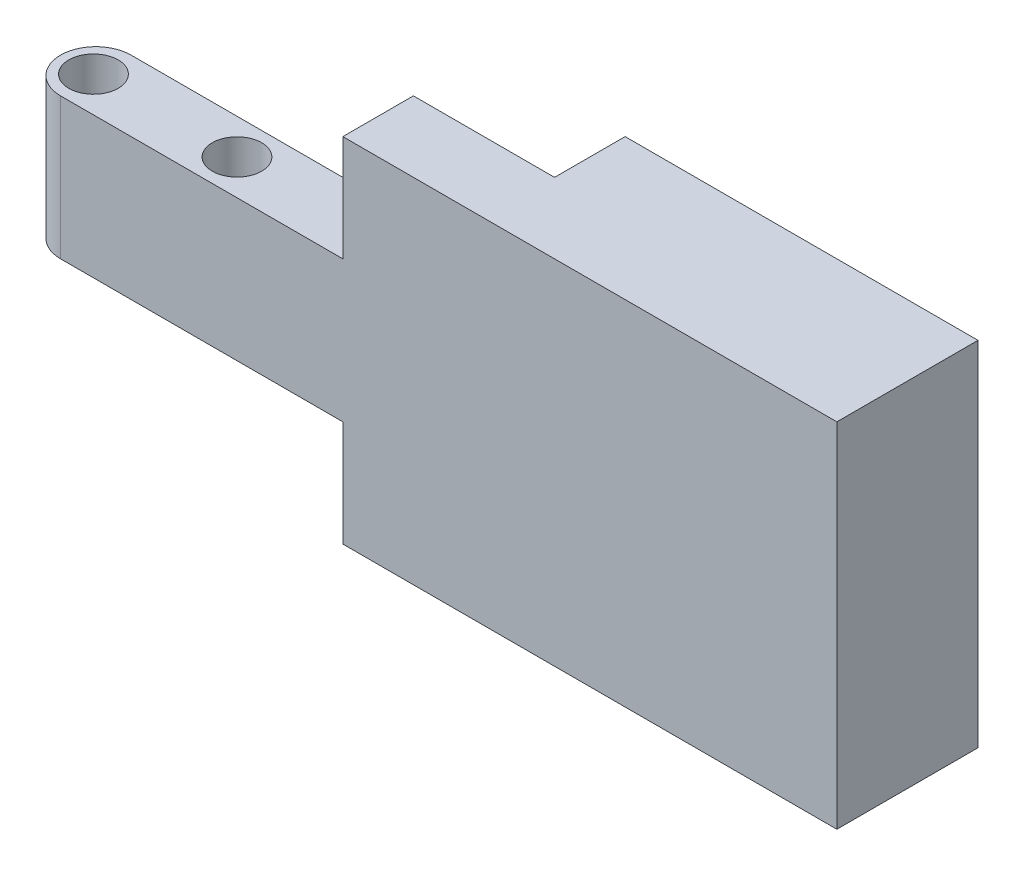
ISO-10303-21;
HEADER;
FILE_DESCRIPTION(('STEP AP214'),'2;1');
FILE_NAME('part.step','',(''),(''),'','','');
FILE_SCHEMA(('AUTOMOTIVE_DESIGN { 1 0 10303 214 1 1 1 1 }'));
ENDSEC;
DATA;
#1=APPLICATION_CONTEXT('core data for automotive mechanical design processes');
#2=APPLICATION_PROTOCOL_DEFINITION('international standard','automotive_design',2000,#1);
#3=PRODUCT_CONTEXT('',#1,'mechanical');
#4=PRODUCT('Part','Part','',(#3));
#5=PRODUCT_RELATED_PRODUCT_CATEGORY('part','',(#4));
#6=PRODUCT_DEFINITION_FORMATION('','',#4);
#7=PRODUCT_DEFINITION_CONTEXT('part definition',#1,'design');
#8=PRODUCT_DEFINITION('design','',#6,#7);
#9=PRODUCT_DEFINITION_SHAPE('','',#8);
#10=(LENGTH_UNIT() NAMED_UNIT(*) SI_UNIT(.MILLI.,.METRE.));
#11=(NAMED_UNIT(*) PLANE_ANGLE_UNIT() SI_UNIT($,.RADIAN.));
#12=(NAMED_UNIT(*) SI_UNIT($,.STERADIAN.) SOLID_ANGLE_UNIT());
#13=UNCERTAINTY_MEASURE_WITH_UNIT(LENGTH_MEASURE(1.E-05),#10,'distance_accuracy_value','');
#14=(GEOMETRIC_REPRESENTATION_CONTEXT(3) GLOBAL_UNCERTAINTY_ASSIGNED_CONTEXT((#13)) GLOBAL_UNIT_ASSIGNED_CONTEXT((#10,
#11,#12)) REPRESENTATION_CONTEXT('',''));
#15=CARTESIAN_POINT('',(0.,0.,0.));
#16=DIRECTION('',(0.,0.,1.));
#17=DIRECTION('',(1.,0.,0.));
#18=AXIS2_PLACEMENT_3D('',#15,#16,#17);
#19=CARTESIAN_POINT('',(-35.,-25.,5.));
#20=DIRECTION('',(1.,0.,0.));
#21=DIRECTION('',(0.,0.,-1.));
#22=AXIS2_PLACEMENT_3D('',#19,#20,#21);
#23=PLANE('',#22);
#24=DIRECTION('',(0.,0.,-1.));
#25=VECTOR('',#24,1.);
#26=CARTESIAN_POINT('',(-35.,10.,-5.));
#27=LINE('',#26,#25);
#28=CARTESIAN_POINT('',(-35.,10.,5.));
#29=VERTEX_POINT('',#28);
#30=CARTESIAN_POINT('',(-35.,10.,-5.));
#31=VERTEX_POINT('',#30);
#32=EDGE_CURVE('E155',#29,#31,#27,.T.);
#33=ORIENTED_EDGE('',*,*,#32,.F.);
#34=DIRECTION('',(0.,1.,0.));
#35=VECTOR('',#34,1.);
#36=CARTESIAN_POINT('',(-35.,-25.,5.));
#37=LINE('',#36,#35);
#38=CARTESIAN_POINT('',(-35.,25.,5.));
#39=VERTEX_POINT('',#38);
#40=EDGE_CURVE('E195',#29,#39,#37,.T.);
#41=ORIENTED_EDGE('',*,*,#40,.T.);
#42=DIRECTION('',(0.,0.,-1.));
#43=VECTOR('',#42,1.);
#44=CARTESIAN_POINT('',(-35.,25.,5.));
#45=LINE('',#44,#43);
#46=CARTESIAN_POINT('',(-35.,25.,-5.));
#47=VERTEX_POINT('',#46);
#48=EDGE_CURVE('E181',#39,#47,#45,.T.);
#49=ORIENTED_EDGE('',*,*,#48,.T.);
#50=DIRECTION('',(0.,1.,0.));
#51=VECTOR('',#50,1.);
#52=CARTESIAN_POINT('',(-35.,-25.,-5.));
#53=LINE('',#52,#51);
#54=EDGE_CURVE('E191',#31,#47,#53,.T.);
#55=ORIENTED_EDGE('',*,*,#54,.F.);
#56=EDGE_LOOP('',(#33,#41,#49,#55));
#57=FACE_BOUND('',#56,.T.);
#58=ADVANCED_FACE('F32',(#57),#23,.F.);
#59=CARTESIAN_POINT('',(-35.,-25.,-5.));
#60=DIRECTION('',(0.,0.,1.));
#61=DIRECTION('',(1.,0.,0.));
#62=AXIS2_PLACEMENT_3D('',#59,#60,#61);
#63=PLANE('',#62);
#64=DIRECTION('',(1.,0.,0.));
#65=VECTOR('',#64,1.);
#66=CARTESIAN_POINT('',(-35.,25.,-5.));
#67=LINE('',#66,#65);
#68=CARTESIAN_POINT('',(-15.,25.,-5.));
#69=VERTEX_POINT('',#68);
#70=EDGE_CURVE('E172',#47,#69,#67,.T.);
#71=ORIENTED_EDGE('',*,*,#70,.T.);
#72=DIRECTION('',(0.,-1.,0.));
#73=VECTOR('',#72,1.);
#74=CARTESIAN_POINT('',(-15.,-25.,-5.));
#75=LINE('',#74,#73);
#76=CARTESIAN_POINT('',(-15.,-25.,-5.));
#77=VERTEX_POINT('',#76);
#78=EDGE_CURVE('E140',#69,#77,#75,.T.);
#79=ORIENTED_EDGE('',*,*,#78,.T.);
#80=DIRECTION('',(1.,0.,0.));
#81=VECTOR('',#80,1.);
#82=CARTESIAN_POINT('',(-35.,-25.,-5.));
#83=LINE('',#82,#81);
#84=CARTESIAN_POINT('',(-35.,-25.,-5.));
#85=VERTEX_POINT('',#84);
#86=EDGE_CURVE('E117',#85,#77,#83,.T.);
#87=ORIENTED_EDGE('',*,*,#86,.F.);
#88=CARTESIAN_POINT('',(-35.,-10.,-5.));
#89=VERTEX_POINT('',#88);
#90=EDGE_CURVE('E192',#85,#89,#53,.T.);
#91=ORIENTED_EDGE('',*,*,#90,.T.);
#92=DIRECTION('',(-1.,0.,0.));
#93=VECTOR('',#92,1.);
#94=CARTESIAN_POINT('',(-75.,-10.,-5.));
#95=LINE('',#94,#93);
#96=CARTESIAN_POINT('',(-75.,-10.,-5.));
#97=VERTEX_POINT('',#96);
#98=EDGE_CURVE('E49',#89,#97,#95,.T.);
#99=ORIENTED_EDGE('',*,*,#98,.T.);
#100=DIRECTION('',(0.,1.,0.));
#101=VECTOR('',#100,1.);
#102=CARTESIAN_POINT('',(-75.,-10.,-5.));
#103=LINE('',#102,#101);
#104=CARTESIAN_POINT('',(-75.,10.,-5.));
#105=VERTEX_POINT('',#104);
#106=EDGE_CURVE('E170',#97,#105,#103,.T.);
#107=ORIENTED_EDGE('',*,*,#106,.T.);
#108=DIRECTION('',(-1.,0.,0.));
#109=VECTOR('',#108,1.);
#110=CARTESIAN_POINT('',(-75.,10.,-5.));
#111=LINE('',#110,#109);
#112=EDGE_CURVE('E157',#31,#105,#111,.T.);
#113=ORIENTED_EDGE('',*,*,#112,.F.);
#114=ORIENTED_EDGE('',*,*,#54,.T.);
#115=EDGE_LOOP('',(#71,#79,#87,#91,#99,#107,#113,#114));
#116=FACE_BOUND('',#115,.T.);
#117=ADVANCED_FACE('F34',(#116),#63,.F.);
#118=CARTESIAN_POINT('',(35.,-25.,5.));
#119=DIRECTION('',(1.,0.,0.));
#120=DIRECTION('',(0.,0.,-1.));
#121=AXIS2_PLACEMENT_3D('',#118,#119,#120);
#122=PLANE('',#121);
#123=DIRECTION('',(0.,0.,-1.));
#124=VECTOR('',#123,1.);
#125=CARTESIAN_POINT('',(35.,-25.,5.));
#126=LINE('',#125,#124);
#127=CARTESIAN_POINT('',(35.,-25.,5.));
#128=VERTEX_POINT('',#127);
#129=CARTESIAN_POINT('',(35.,-25.,-15.));
#130=VERTEX_POINT('',#129);
#131=EDGE_CURVE('E185',#128,#130,#126,.T.);
#132=ORIENTED_EDGE('',*,*,#131,.T.);
#133=DIRECTION('',(0.,1.,0.));
#134=VECTOR('',#133,1.);
#135=CARTESIAN_POINT('',(35.,-25.,-15.));
#136=LINE('',#135,#134);
#137=CARTESIAN_POINT('',(35.,25.,-15.));
#138=VERTEX_POINT('',#137);
#139=EDGE_CURVE('E132',#130,#138,#136,.T.);
#140=ORIENTED_EDGE('',*,*,#139,.T.);
#141=DIRECTION('',(0.,0.,-1.));
#142=VECTOR('',#141,1.);
#143=CARTESIAN_POINT('',(35.,25.,5.));
#144=LINE('',#143,#142);
#145=CARTESIAN_POINT('',(35.,25.,5.));
#146=VERTEX_POINT('',#145);
#147=EDGE_CURVE('E176',#146,#138,#144,.T.);
#148=ORIENTED_EDGE('',*,*,#147,.F.);
#149=DIRECTION('',(0.,1.,0.));
#150=VECTOR('',#149,1.);
#151=CARTESIAN_POINT('',(35.,-25.,5.));
#152=LINE('',#151,#150);
#153=EDGE_CURVE('E11',#128,#146,#152,.T.);
#154=ORIENTED_EDGE('',*,*,#153,.F.);
#155=EDGE_LOOP('',(#132,#140,#148,#154));
#156=FACE_BOUND('',#155,.T.);
#157=ADVANCED_FACE('F236',(#156),#122,.T.);
#158=CARTESIAN_POINT('',(-35.,-25.,5.));
#159=DIRECTION('',(0.,0.,1.));
#160=DIRECTION('',(1.,0.,0.));
#161=AXIS2_PLACEMENT_3D('',#158,#159,#160);
#162=PLANE('',#161);
#163=ORIENTED_EDGE('',*,*,#153,.T.);
#164=DIRECTION('',(1.,0.,0.));
#165=VECTOR('',#164,1.);
#166=CARTESIAN_POINT('',(-35.,25.,5.));
#167=LINE('',#166,#165);
#168=EDGE_CURVE('E178',#39,#146,#167,.T.);
#169=ORIENTED_EDGE('',*,*,#168,.F.);
#170=ORIENTED_EDGE('',*,*,#40,.F.);
#171=DIRECTION('',(1.,0.,0.));
#172=VECTOR('',#171,1.);
#173=CARTESIAN_POINT('',(-35.,10.,5.));
#174=LINE('',#173,#172);
#175=CARTESIAN_POINT('',(-75.,10.,5.));
#176=VERTEX_POINT('',#175);
#177=EDGE_CURVE('E153',#176,#29,#174,.T.);
#178=ORIENTED_EDGE('',*,*,#177,.F.);
#179=DIRECTION('',(0.,1.,0.));
#180=VECTOR('',#179,1.);
#181=CARTESIAN_POINT('',(-75.,-10.,5.));
#182=LINE('',#181,#180);
#183=CARTESIAN_POINT('',(-75.,-10.,5.));
#184=VERTEX_POINT('',#183);
#185=EDGE_CURVE('E169',#184,#176,#182,.T.);
#186=ORIENTED_EDGE('',*,*,#185,.F.);
#187=DIRECTION('',(1.,0.,0.));
#188=VECTOR('',#187,1.);
#189=CARTESIAN_POINT('',(-35.,-10.,5.));
#190=LINE('',#189,#188);
#191=CARTESIAN_POINT('',(-35.,-10.,5.));
#192=VERTEX_POINT('',#191);
#193=EDGE_CURVE('E163',#184,#192,#190,.T.);
#194=ORIENTED_EDGE('',*,*,#193,.T.);
#195=CARTESIAN_POINT('',(-35.,-25.,5.));
#196=VERTEX_POINT('',#195);
#197=EDGE_CURVE('E41',#196,#192,#37,.T.);
#198=ORIENTED_EDGE('',*,*,#197,.F.);
#199=DIRECTION('',(1.,0.,0.));
#200=VECTOR('',#199,1.);
#201=CARTESIAN_POINT('',(-35.,-25.,5.));
#202=LINE('',#201,#200);
#203=EDGE_CURVE('E187',#196,#128,#202,.T.);
#204=ORIENTED_EDGE('',*,*,#203,.T.);
#205=EDGE_LOOP('',(#163,#169,#170,#178,#186,#194,#198,#204));
#206=FACE_BOUND('',#205,.T.);
#207=ADVANCED_FACE('F222',(#206),#162,.T.);
#208=ORIENTED_EDGE('',*,*,#197,.T.);
#209=DIRECTION('',(0.,0.,-1.));
#210=VECTOR('',#209,1.);
#211=CARTESIAN_POINT('',(-35.,-10.,-5.));
#212=LINE('',#211,#210);
#213=EDGE_CURVE('E166',#192,#89,#212,.T.);
#214=ORIENTED_EDGE('',*,*,#213,.T.);
#215=ORIENTED_EDGE('',*,*,#90,.F.);
#216=DIRECTION('',(0.,0.,-1.));
#217=VECTOR('',#216,1.);
#218=CARTESIAN_POINT('',(-35.,-25.,5.));
#219=LINE('',#218,#217);
#220=EDGE_CURVE('E57',#196,#85,#219,.T.);
#221=ORIENTED_EDGE('',*,*,#220,.F.);
#222=EDGE_LOOP('',(#208,#214,#215,#221));
#223=FACE_BOUND('',#222,.T.);
#224=ADVANCED_FACE('F220',(#223),#23,.F.);
#225=CARTESIAN_POINT('',(0.,-25.,0.));
#226=DIRECTION('',(0.,1.,0.));
#227=DIRECTION('',(0.,0.,1.));
#228=AXIS2_PLACEMENT_3D('',#225,#226,#227);
#229=PLANE('',#228);
#230=ORIENTED_EDGE('',*,*,#86,.T.);
#231=DIRECTION('',(0.,0.,1.));
#232=VECTOR('',#231,1.);
#233=CARTESIAN_POINT('',(-15.,-25.,-15.));
#234=LINE('',#233,#232);
#235=CARTESIAN_POINT('',(-15.,-25.,-15.));
#236=VERTEX_POINT('',#235);
#237=EDGE_CURVE('E111',#236,#77,#234,.T.);
#238=ORIENTED_EDGE('',*,*,#237,.F.);
#239=DIRECTION('',(1.,0.,0.));
#240=VECTOR('',#239,1.);
#241=CARTESIAN_POINT('',(35.,-25.,-15.));
#242=LINE('',#241,#240);
#243=EDGE_CURVE('E115',#236,#130,#242,.T.);
#244=ORIENTED_EDGE('',*,*,#243,.T.);
#245=ORIENTED_EDGE('',*,*,#131,.F.);
#246=ORIENTED_EDGE('',*,*,#203,.F.);
#247=ORIENTED_EDGE('',*,*,#220,.T.);
#248=EDGE_LOOP('',(#230,#238,#244,#245,#246,#247));
#249=FACE_BOUND('',#248,.T.);
#250=ADVANCED_FACE('F113',(#249),#229,.F.);
#251=CARTESIAN_POINT('',(0.,25.,0.));
#252=DIRECTION('',(0.,1.,0.));
#253=DIRECTION('',(0.,0.,1.));
#254=AXIS2_PLACEMENT_3D('',#251,#252,#253);
#255=PLANE('',#254);
#256=ORIENTED_EDGE('',*,*,#147,.T.);
#257=DIRECTION('',(-1.,0.,0.));
#258=VECTOR('',#257,1.);
#259=CARTESIAN_POINT('',(35.,25.,-15.));
#260=LINE('',#259,#258);
#261=CARTESIAN_POINT('',(-15.,25.,-15.));
#262=VERTEX_POINT('',#261);
#263=EDGE_CURVE('E122',#138,#262,#260,.T.);
#264=ORIENTED_EDGE('',*,*,#263,.T.);
#265=DIRECTION('',(0.,0.,1.));
#266=VECTOR('',#265,1.);
#267=CARTESIAN_POINT('',(-15.,25.,-15.));
#268=LINE('',#267,#266);
#269=EDGE_CURVE('E121',#262,#69,#268,.T.);
#270=ORIENTED_EDGE('',*,*,#269,.T.);
#271=ORIENTED_EDGE('',*,*,#70,.F.);
#272=ORIENTED_EDGE('',*,*,#48,.F.);
#273=ORIENTED_EDGE('',*,*,#168,.T.);
#274=EDGE_LOOP('',(#256,#264,#270,#271,#272,#273));
#275=FACE_BOUND('',#274,.T.);
#276=ADVANCED_FACE('F233',(#275),#255,.T.);
#277=CARTESIAN_POINT('',(-75.,-10.,0.));
#278=DIRECTION('',(0.,1.,0.));
#279=DIRECTION('',(0.,0.,1.));
#280=AXIS2_PLACEMENT_3D('',#277,#278,#279);
#281=CYLINDRICAL_SURFACE('',#280,5.);
#282=ORIENTED_EDGE('',*,*,#185,.T.);
#283=CARTESIAN_POINT('',(-75.,10.,0.));
#284=DIRECTION('',(0.,1.,0.));
#285=DIRECTION('',(0.,0.,1.));
#286=AXIS2_PLACEMENT_3D('',#283,#284,#285);
#287=CIRCLE('',#286,5.);
#288=EDGE_CURVE('E150',#105,#176,#287,.T.);
#289=ORIENTED_EDGE('',*,*,#288,.F.);
#290=ORIENTED_EDGE('',*,*,#106,.F.);
#291=CARTESIAN_POINT('',(-75.,-10.,0.));
#292=DIRECTION('',(0.,1.,0.));
#293=DIRECTION('',(0.,0.,1.));
#294=AXIS2_PLACEMENT_3D('',#291,#292,#293);
#295=CIRCLE('',#294,5.);
#296=EDGE_CURVE('E160',#97,#184,#295,.T.);
#297=ORIENTED_EDGE('',*,*,#296,.T.);
#298=EDGE_LOOP('',(#282,#289,#290,#297));
#299=FACE_BOUND('',#298,.T.);
#300=ADVANCED_FACE('F212',(#299),#281,.T.);
#301=CARTESIAN_POINT('',(-75.,-10.,0.));
#302=DIRECTION('',(0.,1.,0.));
#303=DIRECTION('',(0.,0.,1.));
#304=AXIS2_PLACEMENT_3D('',#301,#302,#303);
#305=PLANE('',#304);
#306=CARTESIAN_POINT('',(-75.3331770971365,-10.,0.));
#307=DIRECTION('',(0.,1.,0.));
#308=DIRECTION('',(0.,0.,1.));
#309=AXIS2_PLACEMENT_3D('',#306,#307,#308);
#310=CIRCLE('',#309,3.50000000000001);
#311=CARTESIAN_POINT('',(-75.3331770971365,-10.,3.50000000000001));
#312=VERTEX_POINT('',#311);
#313=EDGE_CURVE('E147',#312,#312,#310,.F.);
#314=ORIENTED_EDGE('',*,*,#313,.F.);
#315=EDGE_LOOP('',(#314));
#316=FACE_BOUND('',#315,.T.);
#317=CARTESIAN_POINT('',(-55.,-10.,0.));
#318=DIRECTION('',(0.,1.,0.));
#319=DIRECTION('',(0.,0.,1.));
#320=AXIS2_PLACEMENT_3D('',#317,#318,#319);
#321=CIRCLE('',#320,3.5);
#322=CARTESIAN_POINT('',(-55.,-10.,3.5));
#323=VERTEX_POINT('',#322);
#324=EDGE_CURVE('E144',#323,#323,#321,.F.);
#325=ORIENTED_EDGE('',*,*,#324,.F.);
#326=EDGE_LOOP('',(#325));
#327=FACE_BOUND('',#326,.T.);
#328=ORIENTED_EDGE('',*,*,#296,.F.);
#329=ORIENTED_EDGE('',*,*,#98,.F.);
#330=ORIENTED_EDGE('',*,*,#213,.F.);
#331=ORIENTED_EDGE('',*,*,#193,.F.);
#332=EDGE_LOOP('',(#328,#329,#330,#331));
#333=FACE_BOUND('',#332,.T.);
#334=ADVANCED_FACE('F210',(#316,#327,#333),#305,.F.);
#335=CARTESIAN_POINT('',(-75.,10.,0.));
#336=DIRECTION('',(0.,1.,0.));
#337=DIRECTION('',(0.,0.,1.));
#338=AXIS2_PLACEMENT_3D('',#335,#336,#337);
#339=PLANE('',#338);
#340=CARTESIAN_POINT('',(-75.3331770971365,10.,0.));
#341=DIRECTION('',(0.,1.,0.));
#342=DIRECTION('',(0.,0.,1.));
#343=AXIS2_PLACEMENT_3D('',#340,#341,#342);
#344=CIRCLE('',#343,3.50000000000001);
#345=CARTESIAN_POINT('',(-75.3331770971365,10.,3.50000000000001));
#346=VERTEX_POINT('',#345);
#347=EDGE_CURVE('E36',#346,#346,#344,.F.);
#348=ORIENTED_EDGE('',*,*,#347,.T.);
#349=EDGE_LOOP('',(#348));
#350=FACE_BOUND('',#349,.T.);
#351=CARTESIAN_POINT('',(-55.,10.,0.));
#352=DIRECTION('',(0.,1.,0.));
#353=DIRECTION('',(0.,0.,1.));
#354=AXIS2_PLACEMENT_3D('',#351,#352,#353);
#355=CIRCLE('',#354,3.5);
#356=CARTESIAN_POINT('',(-55.,10.,3.5));
#357=VERTEX_POINT('',#356);
#358=EDGE_CURVE('E143',#357,#357,#355,.F.);
#359=ORIENTED_EDGE('',*,*,#358,.T.);
#360=EDGE_LOOP('',(#359));
#361=FACE_BOUND('',#360,.T.);
#362=ORIENTED_EDGE('',*,*,#288,.T.);
#363=ORIENTED_EDGE('',*,*,#177,.T.);
#364=ORIENTED_EDGE('',*,*,#32,.T.);
#365=ORIENTED_EDGE('',*,*,#112,.T.);
#366=EDGE_LOOP('',(#362,#363,#364,#365));
#367=FACE_BOUND('',#366,.T.);
#368=ADVANCED_FACE('F200',(#350,#361,#367),#339,.T.);
#369=CARTESIAN_POINT('',(-55.,19.,0.));
#370=DIRECTION('',(0.,-1.,0.));
#371=DIRECTION('',(0.,0.,-1.));
#372=AXIS2_PLACEMENT_3D('',#369,#370,#371);
#373=CYLINDRICAL_SURFACE('',#372,3.5);
#374=ORIENTED_EDGE('',*,*,#358,.F.);
#375=EDGE_LOOP('',(#374));
#376=FACE_BOUND('',#375,.T.);
#377=ORIENTED_EDGE('',*,*,#324,.T.);
#378=EDGE_LOOP('',(#377));
#379=FACE_BOUND('',#378,.T.);
#380=ADVANCED_FACE('F203',(#376,#379),#373,.F.);
#381=CARTESIAN_POINT('',(-75.3331770971365,19.,0.));
#382=DIRECTION('',(0.,-1.,0.));
#383=DIRECTION('',(0.,0.,-1.));
#384=AXIS2_PLACEMENT_3D('',#381,#382,#383);
#385=CYLINDRICAL_SURFACE('',#384,3.50000000000001);
#386=ORIENTED_EDGE('',*,*,#347,.F.);
#387=EDGE_LOOP('',(#386));
#388=FACE_BOUND('',#387,.T.);
#389=ORIENTED_EDGE('',*,*,#313,.T.);
#390=EDGE_LOOP('',(#389));
#391=FACE_BOUND('',#390,.T.);
#392=ADVANCED_FACE('F206',(#388,#391),#385,.F.);
#393=CARTESIAN_POINT('',(-15.,-25.,-15.));
#394=DIRECTION('',(-1.,0.,0.));
#395=DIRECTION('',(0.,0.,1.));
#396=AXIS2_PLACEMENT_3D('',#393,#394,#395);
#397=PLANE('',#396);
#398=ORIENTED_EDGE('',*,*,#78,.F.);
#399=ORIENTED_EDGE('',*,*,#269,.F.);
#400=DIRECTION('',(0.,-1.,0.));
#401=VECTOR('',#400,1.);
#402=CARTESIAN_POINT('',(-15.,-25.,-15.));
#403=LINE('',#402,#401);
#404=EDGE_CURVE('E129',#262,#236,#403,.T.);
#405=ORIENTED_EDGE('',*,*,#404,.T.);
#406=ORIENTED_EDGE('',*,*,#237,.T.);
#407=EDGE_LOOP('',(#398,#399,#405,#406));
#408=FACE_BOUND('',#407,.T.);
#409=ADVANCED_FACE('F134',(#408),#397,.T.);
#410=CARTESIAN_POINT('',(0.,0.,-15.));
#411=DIRECTION('',(0.,0.,1.));
#412=DIRECTION('',(1.,0.,0.));
#413=AXIS2_PLACEMENT_3D('',#410,#411,#412);
#414=PLANE('',#413);
#415=ORIENTED_EDGE('',*,*,#404,.F.);
#416=ORIENTED_EDGE('',*,*,#263,.F.);
#417=ORIENTED_EDGE('',*,*,#139,.F.);
#418=ORIENTED_EDGE('',*,*,#243,.F.);
#419=EDGE_LOOP('',(#415,#416,#417,#418));
#420=FACE_BOUND('',#419,.T.);
#421=ADVANCED_FACE('F127',(#420),#414,.F.);
#422=CLOSED_SHELL('',(#58,#117,#157,#207,#224,#250,#276,#300,#334,#368,#380,#392,#409,#421));
#423=MANIFOLD_SOLID_BREP('B2',#422);
#424=ADVANCED_BREP_SHAPE_REPRESENTATION('',(#18,#423),#14);
#425=SHAPE_DEFINITION_REPRESENTATION(#9,#424);
ENDSEC;
END-ISO-10303-21;
